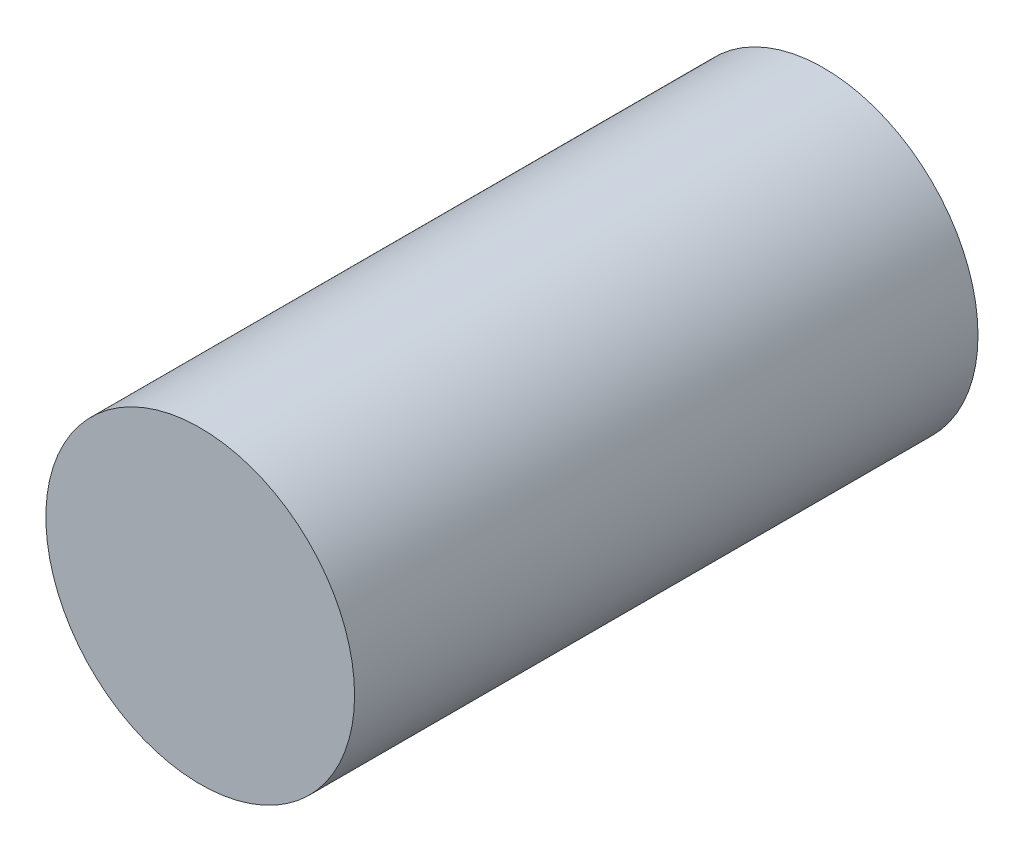
ISO-10303-21;
HEADER;
FILE_DESCRIPTION(('STEP AP214'),'2;1');
FILE_NAME('part.step','',(''),(''),'','','');
FILE_SCHEMA(('AUTOMOTIVE_DESIGN { 1 0 10303 214 1 1 1 1 }'));
ENDSEC;
DATA;
#1=APPLICATION_CONTEXT('core data for automotive mechanical design processes');
#2=APPLICATION_PROTOCOL_DEFINITION('international standard','automotive_design',2000,#1);
#3=PRODUCT_CONTEXT('',#1,'mechanical');
#4=PRODUCT('Part','Part','',(#3));
#5=PRODUCT_RELATED_PRODUCT_CATEGORY('part','',(#4));
#6=PRODUCT_DEFINITION_FORMATION('','',#4);
#7=PRODUCT_DEFINITION_CONTEXT('part definition',#1,'design');
#8=PRODUCT_DEFINITION('design','',#6,#7);
#9=PRODUCT_DEFINITION_SHAPE('','',#8);
#10=(LENGTH_UNIT() NAMED_UNIT(*) SI_UNIT(.MILLI.,.METRE.));
#11=(NAMED_UNIT(*) PLANE_ANGLE_UNIT() SI_UNIT($,.RADIAN.));
#12=(NAMED_UNIT(*) SI_UNIT($,.STERADIAN.) SOLID_ANGLE_UNIT());
#13=UNCERTAINTY_MEASURE_WITH_UNIT(LENGTH_MEASURE(1.E-05),#10,'distance_accuracy_value','');
#14=(GEOMETRIC_REPRESENTATION_CONTEXT(3) GLOBAL_UNCERTAINTY_ASSIGNED_CONTEXT((#13)) GLOBAL_UNIT_ASSIGNED_CONTEXT((#10,
#11,#12)) REPRESENTATION_CONTEXT('',''));
#15=CARTESIAN_POINT('',(0.,0.,0.));
#16=DIRECTION('',(0.,0.,1.));
#17=DIRECTION('',(1.,0.,0.));
#18=AXIS2_PLACEMENT_3D('',#15,#16,#17);
#19=CARTESIAN_POINT('',(0.,0.,40.));
#20=DIRECTION('',(0.,0.,-1.));
#21=DIRECTION('',(-1.,0.,0.));
#22=AXIS2_PLACEMENT_3D('',#19,#20,#21);
#23=CYLINDRICAL_SURFACE('',#22,9.90401146595299);
#24=CARTESIAN_POINT('',(0.,0.,40.));
#25=DIRECTION('',(0.,0.,1.));
#26=DIRECTION('',(1.,0.,0.));
#27=AXIS2_PLACEMENT_3D('',#24,#25,#26);
#28=CIRCLE('',#27,9.90401146595299);
#29=CARTESIAN_POINT('',(9.90401146595299,0.,40.));
#30=VERTEX_POINT('',#29);
#31=EDGE_CURVE('E10',#30,#30,#28,.T.);
#32=ORIENTED_EDGE('',*,*,#31,.F.);
#33=EDGE_LOOP('',(#32));
#34=FACE_BOUND('',#33,.T.);
#35=CARTESIAN_POINT('',(0.,0.,0.));
#36=DIRECTION('',(0.,0.,1.));
#37=DIRECTION('',(1.,0.,0.));
#38=AXIS2_PLACEMENT_3D('',#35,#36,#37);
#39=CIRCLE('',#38,9.90401146595299);
#40=CARTESIAN_POINT('',(9.90401146595299,0.,0.));
#41=VERTEX_POINT('',#40);
#42=EDGE_CURVE('E46',#41,#41,#39,.T.);
#43=ORIENTED_EDGE('',*,*,#42,.T.);
#44=EDGE_LOOP('',(#43));
#45=FACE_BOUND('',#44,.T.);
#46=ADVANCED_FACE('F43',(#34,#45),#23,.T.);
#47=CARTESIAN_POINT('',(0.,0.,40.));
#48=DIRECTION('',(0.,0.,1.));
#49=DIRECTION('',(1.,0.,0.));
#50=AXIS2_PLACEMENT_3D('',#47,#48,#49);
#51=PLANE('',#50);
#52=ORIENTED_EDGE('',*,*,#31,.T.);
#53=EDGE_LOOP('',(#52));
#54=FACE_BOUND('',#53,.T.);
#55=ADVANCED_FACE('F60',(#54),#51,.T.);
#56=CARTESIAN_POINT('',(0.,0.,0.));
#57=DIRECTION('',(0.,0.,1.));
#58=DIRECTION('',(1.,0.,0.));
#59=AXIS2_PLACEMENT_3D('',#56,#57,#58);
#60=PLANE('',#59);
#61=ORIENTED_EDGE('',*,*,#42,.F.);
#62=EDGE_LOOP('',(#61));
#63=FACE_BOUND('',#62,.T.);
#64=ADVANCED_FACE('F58',(#63),#60,.F.);
#65=CLOSED_SHELL('',(#46,#55,#64));
#66=MANIFOLD_SOLID_BREP('B2',#65);
#67=ADVANCED_BREP_SHAPE_REPRESENTATION('',(#18,#66),#14);
#68=SHAPE_DEFINITION_REPRESENTATION(#9,#67);
ENDSEC;
END-ISO-10303-21;
